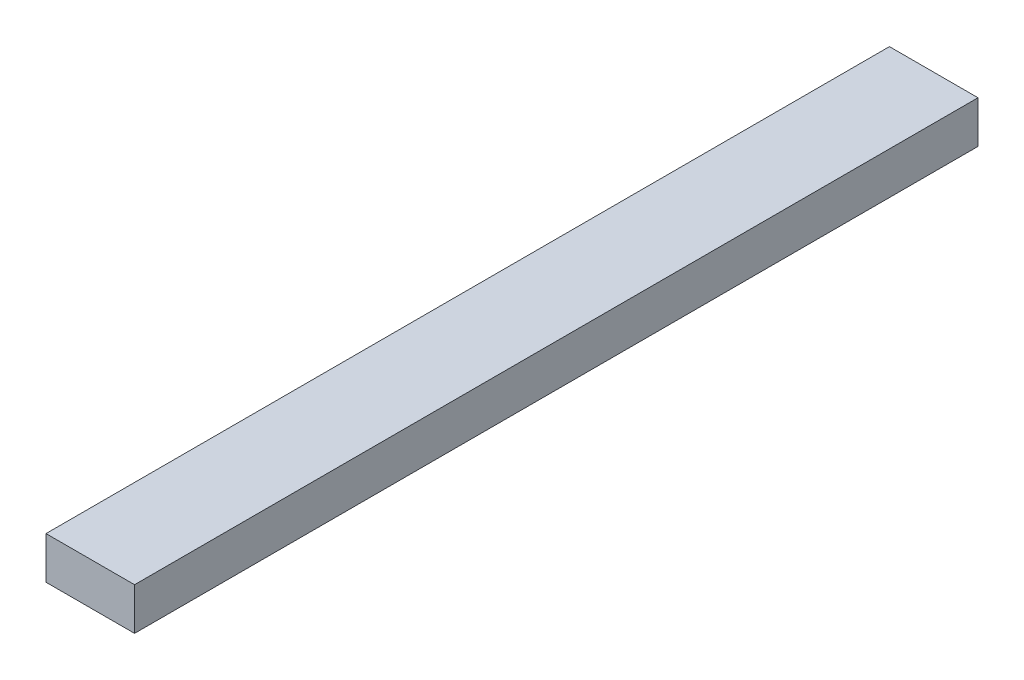
ISO-10303-21;
HEADER;
FILE_DESCRIPTION(('STEP AP214'),'2;1');
FILE_NAME('part.step','',(''),(''),'','','');
FILE_SCHEMA(('AUTOMOTIVE_DESIGN { 1 0 10303 214 1 1 1 1 }'));
ENDSEC;
DATA;
#1=APPLICATION_CONTEXT('core data for automotive mechanical design processes');
#2=APPLICATION_PROTOCOL_DEFINITION('international standard','automotive_design',2000,#1);
#3=PRODUCT_CONTEXT('',#1,'mechanical');
#4=PRODUCT('Part','Part','',(#3));
#5=PRODUCT_RELATED_PRODUCT_CATEGORY('part','',(#4));
#6=PRODUCT_DEFINITION_FORMATION('','',#4);
#7=PRODUCT_DEFINITION_CONTEXT('part definition',#1,'design');
#8=PRODUCT_DEFINITION('design','',#6,#7);
#9=PRODUCT_DEFINITION_SHAPE('','',#8);
#10=(LENGTH_UNIT() NAMED_UNIT(*) SI_UNIT(.MILLI.,.METRE.));
#11=(NAMED_UNIT(*) PLANE_ANGLE_UNIT() SI_UNIT($,.RADIAN.));
#12=(NAMED_UNIT(*) SI_UNIT($,.STERADIAN.) SOLID_ANGLE_UNIT());
#13=UNCERTAINTY_MEASURE_WITH_UNIT(LENGTH_MEASURE(1.E-05),#10,'distance_accuracy_value','');
#14=(GEOMETRIC_REPRESENTATION_CONTEXT(3) GLOBAL_UNCERTAINTY_ASSIGNED_CONTEXT((#13)) GLOBAL_UNIT_ASSIGNED_CONTEXT((#10,
#11,#12)) REPRESENTATION_CONTEXT('',''));
#15=CARTESIAN_POINT('',(0.,0.,0.));
#16=DIRECTION('',(0.,0.,1.));
#17=DIRECTION('',(1.,0.,0.));
#18=AXIS2_PLACEMENT_3D('',#15,#16,#17);
#19=CARTESIAN_POINT('',(-254.,1454.,-90.));
#20=DIRECTION('',(-1.,0.,0.));
#21=DIRECTION('',(0.,1.,0.));
#22=AXIS2_PLACEMENT_3D('',#19,#20,#21);
#23=PLANE('',#22);
#24=DIRECTION('',(0.,0.,1.));
#25=VECTOR('',#24,1.);
#26=CARTESIAN_POINT('',(-254.,1444.,-90.));
#27=LINE('',#26,#25);
#28=CARTESIAN_POINT('',(-254.,1444.,-90.));
#29=VERTEX_POINT('',#28);
#30=CARTESIAN_POINT('',(-254.,1444.,110.));
#31=VERTEX_POINT('',#30);
#32=EDGE_CURVE('E11',#29,#31,#27,.T.);
#33=ORIENTED_EDGE('',*,*,#32,.T.);
#34=DIRECTION('',(0.,-1.,0.));
#35=VECTOR('',#34,1.);
#36=CARTESIAN_POINT('',(-254.,1454.,110.));
#37=LINE('',#36,#35);
#38=CARTESIAN_POINT('',(-254.,1454.,110.));
#39=VERTEX_POINT('',#38);
#40=EDGE_CURVE('E56',#39,#31,#37,.T.);
#41=ORIENTED_EDGE('',*,*,#40,.F.);
#42=DIRECTION('',(0.,0.,1.));
#43=VECTOR('',#42,1.);
#44=CARTESIAN_POINT('',(-254.,1454.,-90.));
#45=LINE('',#44,#43);
#46=CARTESIAN_POINT('',(-254.,1454.,-90.));
#47=VERTEX_POINT('',#46);
#48=EDGE_CURVE('E31',#47,#39,#45,.T.);
#49=ORIENTED_EDGE('',*,*,#48,.F.);
#50=DIRECTION('',(0.,-1.,0.));
#51=VECTOR('',#50,1.);
#52=CARTESIAN_POINT('',(-254.,1454.,-90.));
#53=LINE('',#52,#51);
#54=EDGE_CURVE('E58',#47,#29,#53,.T.);
#55=ORIENTED_EDGE('',*,*,#54,.T.);
#56=EDGE_LOOP('',(#33,#41,#49,#55));
#57=FACE_BOUND('',#56,.T.);
#58=ADVANCED_FACE('F17',(#57),#23,.T.);
#59=CARTESIAN_POINT('',(-254.,1444.,-90.));
#60=DIRECTION('',(0.,-1.,0.));
#61=DIRECTION('',(-1.,0.,0.));
#62=AXIS2_PLACEMENT_3D('',#59,#60,#61);
#63=PLANE('',#62);
#64=DIRECTION('',(0.,0.,1.));
#65=VECTOR('',#64,1.);
#66=CARTESIAN_POINT('',(-233.,1444.,-90.));
#67=LINE('',#66,#65);
#68=CARTESIAN_POINT('',(-233.,1444.,-90.));
#69=VERTEX_POINT('',#68);
#70=CARTESIAN_POINT('',(-233.,1444.,110.));
#71=VERTEX_POINT('',#70);
#72=EDGE_CURVE('E24',#69,#71,#67,.T.);
#73=ORIENTED_EDGE('',*,*,#72,.T.);
#74=DIRECTION('',(1.,0.,0.));
#75=VECTOR('',#74,1.);
#76=CARTESIAN_POINT('',(-254.,1444.,110.));
#77=LINE('',#76,#75);
#78=EDGE_CURVE('E63',#31,#71,#77,.T.);
#79=ORIENTED_EDGE('',*,*,#78,.F.);
#80=ORIENTED_EDGE('',*,*,#32,.F.);
#81=DIRECTION('',(1.,0.,0.));
#82=VECTOR('',#81,1.);
#83=CARTESIAN_POINT('',(-254.,1444.,-90.));
#84=LINE('',#83,#82);
#85=EDGE_CURVE('E77',#29,#69,#84,.T.);
#86=ORIENTED_EDGE('',*,*,#85,.T.);
#87=EDGE_LOOP('',(#73,#79,#80,#86));
#88=FACE_BOUND('',#87,.T.);
#89=ADVANCED_FACE('F64',(#88),#63,.T.);
#90=CARTESIAN_POINT('',(-233.,1444.,-90.));
#91=DIRECTION('',(1.,0.,0.));
#92=DIRECTION('',(0.,-1.,0.));
#93=AXIS2_PLACEMENT_3D('',#90,#91,#92);
#94=PLANE('',#93);
#95=DIRECTION('',(0.,0.,1.));
#96=VECTOR('',#95,1.);
#97=CARTESIAN_POINT('',(-233.,1454.,-90.));
#98=LINE('',#97,#96);
#99=CARTESIAN_POINT('',(-233.,1454.,-90.));
#100=VERTEX_POINT('',#99);
#101=CARTESIAN_POINT('',(-233.,1454.,110.));
#102=VERTEX_POINT('',#101);
#103=EDGE_CURVE('E38',#100,#102,#98,.T.);
#104=ORIENTED_EDGE('',*,*,#103,.T.);
#105=DIRECTION('',(0.,1.,0.));
#106=VECTOR('',#105,1.);
#107=CARTESIAN_POINT('',(-233.,1444.,110.));
#108=LINE('',#107,#106);
#109=EDGE_CURVE('E68',#71,#102,#108,.T.);
#110=ORIENTED_EDGE('',*,*,#109,.F.);
#111=ORIENTED_EDGE('',*,*,#72,.F.);
#112=DIRECTION('',(0.,1.,0.));
#113=VECTOR('',#112,1.);
#114=CARTESIAN_POINT('',(-233.,1444.,-90.));
#115=LINE('',#114,#113);
#116=EDGE_CURVE('E79',#69,#100,#115,.T.);
#117=ORIENTED_EDGE('',*,*,#116,.T.);
#118=EDGE_LOOP('',(#104,#110,#111,#117));
#119=FACE_BOUND('',#118,.T.);
#120=ADVANCED_FACE('F86',(#119),#94,.T.);
#121=CARTESIAN_POINT('',(-233.,1454.,-90.));
#122=DIRECTION('',(0.,1.,0.));
#123=DIRECTION('',(1.,0.,0.));
#124=AXIS2_PLACEMENT_3D('',#121,#122,#123);
#125=PLANE('',#124);
#126=ORIENTED_EDGE('',*,*,#48,.T.);
#127=DIRECTION('',(-1.,0.,0.));
#128=VECTOR('',#127,1.);
#129=CARTESIAN_POINT('',(-233.,1454.,110.));
#130=LINE('',#129,#128);
#131=EDGE_CURVE('E72',#102,#39,#130,.T.);
#132=ORIENTED_EDGE('',*,*,#131,.F.);
#133=ORIENTED_EDGE('',*,*,#103,.F.);
#134=DIRECTION('',(-1.,0.,0.));
#135=VECTOR('',#134,1.);
#136=CARTESIAN_POINT('',(-233.,1454.,-90.));
#137=LINE('',#136,#135);
#138=EDGE_CURVE('E81',#100,#47,#137,.T.);
#139=ORIENTED_EDGE('',*,*,#138,.T.);
#140=EDGE_LOOP('',(#126,#132,#133,#139));
#141=FACE_BOUND('',#140,.T.);
#142=ADVANCED_FACE('F89',(#141),#125,.T.);
#143=CARTESIAN_POINT('',(-254.,1444.,-90.));
#144=DIRECTION('',(0.,0.,1.));
#145=DIRECTION('',(0.,-1.,0.));
#146=AXIS2_PLACEMENT_3D('',#143,#144,#145);
#147=PLANE('',#146);
#148=ORIENTED_EDGE('',*,*,#54,.F.);
#149=ORIENTED_EDGE('',*,*,#138,.F.);
#150=ORIENTED_EDGE('',*,*,#116,.F.);
#151=ORIENTED_EDGE('',*,*,#85,.F.);
#152=EDGE_LOOP('',(#148,#149,#150,#151));
#153=FACE_BOUND('',#152,.T.);
#154=ADVANCED_FACE('F91',(#153),#147,.F.);
#155=CARTESIAN_POINT('',(-254.,1444.,110.));
#156=DIRECTION('',(0.,0.,1.));
#157=DIRECTION('',(0.,-1.,0.));
#158=AXIS2_PLACEMENT_3D('',#155,#156,#157);
#159=PLANE('',#158);
#160=ORIENTED_EDGE('',*,*,#40,.T.);
#161=ORIENTED_EDGE('',*,*,#78,.T.);
#162=ORIENTED_EDGE('',*,*,#109,.T.);
#163=ORIENTED_EDGE('',*,*,#131,.T.);
#164=EDGE_LOOP('',(#160,#161,#162,#163));
#165=FACE_BOUND('',#164,.T.);
#166=ADVANCED_FACE('F71',(#165),#159,.T.);
#167=CLOSED_SHELL('',(#58,#89,#120,#142,#154,#166));
#168=MANIFOLD_SOLID_BREP('B1',#167);
#169=ADVANCED_BREP_SHAPE_REPRESENTATION('',(#18,#168),#14);
#170=SHAPE_DEFINITION_REPRESENTATION(#9,#169);
ENDSEC;
END-ISO-10303-21;
